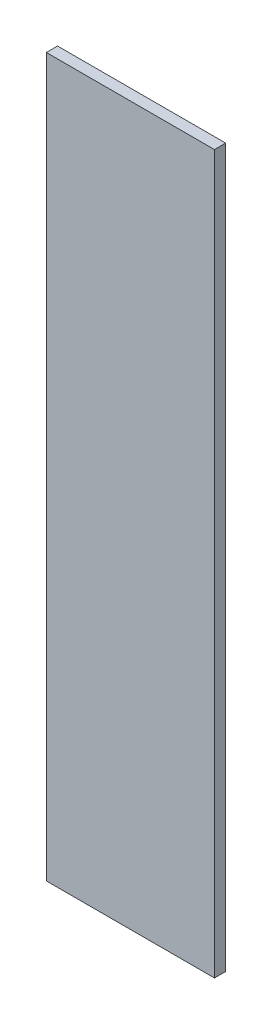
ISO-10303-21;
HEADER;
FILE_DESCRIPTION(('STEP AP214'),'2;1');
FILE_NAME('part.step','',(''),(''),'','','');
FILE_SCHEMA(('AUTOMOTIVE_DESIGN { 1 0 10303 214 1 1 1 1 }'));
ENDSEC;
DATA;
#1=APPLICATION_CONTEXT('core data for automotive mechanical design processes');
#2=APPLICATION_PROTOCOL_DEFINITION('international standard','automotive_design',2000,#1);
#3=PRODUCT_CONTEXT('',#1,'mechanical');
#4=PRODUCT('Part','Part','',(#3));
#5=PRODUCT_RELATED_PRODUCT_CATEGORY('part','',(#4));
#6=PRODUCT_DEFINITION_FORMATION('','',#4);
#7=PRODUCT_DEFINITION_CONTEXT('part definition',#1,'design');
#8=PRODUCT_DEFINITION('design','',#6,#7);
#9=PRODUCT_DEFINITION_SHAPE('','',#8);
#10=(LENGTH_UNIT() NAMED_UNIT(*) SI_UNIT(.MILLI.,.METRE.));
#11=(NAMED_UNIT(*) PLANE_ANGLE_UNIT() SI_UNIT($,.RADIAN.));
#12=(NAMED_UNIT(*) SI_UNIT($,.STERADIAN.) SOLID_ANGLE_UNIT());
#13=UNCERTAINTY_MEASURE_WITH_UNIT(LENGTH_MEASURE(1.E-05),#10,'distance_accuracy_value','');
#14=(GEOMETRIC_REPRESENTATION_CONTEXT(3) GLOBAL_UNCERTAINTY_ASSIGNED_CONTEXT((#13)) GLOBAL_UNIT_ASSIGNED_CONTEXT((#10,
#11,#12)) REPRESENTATION_CONTEXT('',''));
#15=CARTESIAN_POINT('',(0.,0.,0.));
#16=DIRECTION('',(0.,0.,1.));
#17=DIRECTION('',(1.,0.,0.));
#18=AXIS2_PLACEMENT_3D('',#15,#16,#17);
#19=CARTESIAN_POINT('',(-14.5,-32.,-1.));
#20=DIRECTION('',(1.,0.,0.));
#21=DIRECTION('',(0.,0.,-1.));
#22=AXIS2_PLACEMENT_3D('',#19,#20,#21);
#23=PLANE('',#22);
#24=DIRECTION('',(0.,1.,0.));
#25=VECTOR('',#24,1.);
#26=CARTESIAN_POINT('',(-14.5,-32.,0.));
#27=LINE('',#26,#25);
#28=CARTESIAN_POINT('',(-14.5,-32.,0.));
#29=VERTEX_POINT('',#28);
#30=CARTESIAN_POINT('',(-14.5,32.,0.));
#31=VERTEX_POINT('',#30);
#32=EDGE_CURVE('E101',#29,#31,#27,.T.);
#33=ORIENTED_EDGE('',*,*,#32,.F.);
#34=DIRECTION('',(0.,0.,1.));
#35=VECTOR('',#34,1.);
#36=CARTESIAN_POINT('',(-14.5,-32.,-1.));
#37=LINE('',#36,#35);
#38=CARTESIAN_POINT('',(-14.5,-32.,-1.));
#39=VERTEX_POINT('',#38);
#40=EDGE_CURVE('E11',#39,#29,#37,.T.);
#41=ORIENTED_EDGE('',*,*,#40,.F.);
#42=DIRECTION('',(0.,1.,0.));
#43=VECTOR('',#42,1.);
#44=CARTESIAN_POINT('',(-14.5,-32.,-1.));
#45=LINE('',#44,#43);
#46=CARTESIAN_POINT('',(-14.5,32.,-1.));
#47=VERTEX_POINT('',#46);
#48=EDGE_CURVE('E95',#39,#47,#45,.T.);
#49=ORIENTED_EDGE('',*,*,#48,.T.);
#50=DIRECTION('',(0.,0.,1.));
#51=VECTOR('',#50,1.);
#52=CARTESIAN_POINT('',(-14.5,32.,-1.));
#53=LINE('',#52,#51);
#54=EDGE_CURVE('E40',#47,#31,#53,.T.);
#55=ORIENTED_EDGE('',*,*,#54,.T.);
#56=EDGE_LOOP('',(#33,#41,#49,#55));
#57=FACE_BOUND('',#56,.T.);
#58=ADVANCED_FACE('F37',(#57),#23,.T.);
#59=CARTESIAN_POINT('',(-14.5,-32.,-1.));
#60=DIRECTION('',(0.,-1.,0.));
#61=DIRECTION('',(0.,0.,-1.));
#62=AXIS2_PLACEMENT_3D('',#59,#60,#61);
#63=PLANE('',#62);
#64=DIRECTION('',(1.,0.,0.));
#65=VECTOR('',#64,1.);
#66=CARTESIAN_POINT('',(-14.5,-32.,0.));
#67=LINE('',#66,#65);
#68=CARTESIAN_POINT('',(-29.5,-32.,0.));
#69=VERTEX_POINT('',#68);
#70=EDGE_CURVE('E97',#69,#29,#67,.T.);
#71=ORIENTED_EDGE('',*,*,#70,.F.);
#72=DIRECTION('',(0.,0.,1.));
#73=VECTOR('',#72,1.);
#74=CARTESIAN_POINT('',(-29.5,-32.,-1.));
#75=LINE('',#74,#73);
#76=CARTESIAN_POINT('',(-29.5,-32.,-1.));
#77=VERTEX_POINT('',#76);
#78=EDGE_CURVE('E46',#77,#69,#75,.T.);
#79=ORIENTED_EDGE('',*,*,#78,.F.);
#80=DIRECTION('',(1.,0.,0.));
#81=VECTOR('',#80,1.);
#82=CARTESIAN_POINT('',(-14.5,-32.,-1.));
#83=LINE('',#82,#81);
#84=EDGE_CURVE('E92',#77,#39,#83,.T.);
#85=ORIENTED_EDGE('',*,*,#84,.T.);
#86=ORIENTED_EDGE('',*,*,#40,.T.);
#87=EDGE_LOOP('',(#71,#79,#85,#86));
#88=FACE_BOUND('',#87,.T.);
#89=ADVANCED_FACE('F111',(#88),#63,.T.);
#90=CARTESIAN_POINT('',(-29.5,-32.,-1.));
#91=DIRECTION('',(-1.,0.,0.));
#92=DIRECTION('',(0.,-1.,0.));
#93=AXIS2_PLACEMENT_3D('',#90,#91,#92);
#94=PLANE('',#93);
#95=DIRECTION('',(0.,-1.,0.));
#96=VECTOR('',#95,1.);
#97=CARTESIAN_POINT('',(-29.5,-32.,0.));
#98=LINE('',#97,#96);
#99=CARTESIAN_POINT('',(-29.5,32.,0.));
#100=VERTEX_POINT('',#99);
#101=EDGE_CURVE('E87',#100,#69,#98,.T.);
#102=ORIENTED_EDGE('',*,*,#101,.F.);
#103=DIRECTION('',(0.,0.,1.));
#104=VECTOR('',#103,1.);
#105=CARTESIAN_POINT('',(-29.5,32.,-1.));
#106=LINE('',#105,#104);
#107=CARTESIAN_POINT('',(-29.5,32.,-1.));
#108=VERTEX_POINT('',#107);
#109=EDGE_CURVE('E82',#108,#100,#106,.T.);
#110=ORIENTED_EDGE('',*,*,#109,.F.);
#111=DIRECTION('',(0.,-1.,0.));
#112=VECTOR('',#111,1.);
#113=CARTESIAN_POINT('',(-29.5,-32.,-1.));
#114=LINE('',#113,#112);
#115=EDGE_CURVE('E85',#108,#77,#114,.T.);
#116=ORIENTED_EDGE('',*,*,#115,.T.);
#117=ORIENTED_EDGE('',*,*,#78,.T.);
#118=EDGE_LOOP('',(#102,#110,#116,#117));
#119=FACE_BOUND('',#118,.T.);
#120=ADVANCED_FACE('F84',(#119),#94,.T.);
#121=CARTESIAN_POINT('',(-14.5,32.,-1.));
#122=DIRECTION('',(0.,1.,0.));
#123=DIRECTION('',(0.,0.,1.));
#124=AXIS2_PLACEMENT_3D('',#121,#122,#123);
#125=PLANE('',#124);
#126=DIRECTION('',(-1.,0.,0.));
#127=VECTOR('',#126,1.);
#128=CARTESIAN_POINT('',(-14.5,32.,0.));
#129=LINE('',#128,#127);
#130=EDGE_CURVE('E104',#31,#100,#129,.T.);
#131=ORIENTED_EDGE('',*,*,#130,.F.);
#132=ORIENTED_EDGE('',*,*,#54,.F.);
#133=DIRECTION('',(-1.,0.,0.));
#134=VECTOR('',#133,1.);
#135=CARTESIAN_POINT('',(-14.5,32.,-1.));
#136=LINE('',#135,#134);
#137=EDGE_CURVE('E91',#47,#108,#136,.T.);
#138=ORIENTED_EDGE('',*,*,#137,.T.);
#139=ORIENTED_EDGE('',*,*,#109,.T.);
#140=EDGE_LOOP('',(#131,#132,#138,#139));
#141=FACE_BOUND('',#140,.T.);
#142=ADVANCED_FACE('F94',(#141),#125,.T.);
#143=CARTESIAN_POINT('',(0.,0.,-1.));
#144=DIRECTION('',(0.,0.,1.));
#145=DIRECTION('',(1.,0.,0.));
#146=AXIS2_PLACEMENT_3D('',#143,#144,#145);
#147=PLANE('',#146);
#148=ORIENTED_EDGE('',*,*,#48,.F.);
#149=ORIENTED_EDGE('',*,*,#84,.F.);
#150=ORIENTED_EDGE('',*,*,#115,.F.);
#151=ORIENTED_EDGE('',*,*,#137,.F.);
#152=EDGE_LOOP('',(#148,#149,#150,#151));
#153=FACE_BOUND('',#152,.T.);
#154=ADVANCED_FACE('F90',(#153),#147,.F.);
#155=CARTESIAN_POINT('',(0.,0.,0.));
#156=DIRECTION('',(0.,0.,1.));
#157=DIRECTION('',(1.,0.,0.));
#158=AXIS2_PLACEMENT_3D('',#155,#156,#157);
#159=PLANE('',#158);
#160=ORIENTED_EDGE('',*,*,#32,.T.);
#161=ORIENTED_EDGE('',*,*,#130,.T.);
#162=ORIENTED_EDGE('',*,*,#101,.T.);
#163=ORIENTED_EDGE('',*,*,#70,.T.);
#164=EDGE_LOOP('',(#160,#161,#162,#163));
#165=FACE_BOUND('',#164,.T.);
#166=ADVANCED_FACE('F110',(#165),#159,.T.);
#167=CLOSED_SHELL('',(#58,#89,#120,#142,#154,#166));
#168=MANIFOLD_SOLID_BREP('B2',#167);
#169=ADVANCED_BREP_SHAPE_REPRESENTATION('',(#18,#168),#14);
#170=SHAPE_DEFINITION_REPRESENTATION(#9,#169);
ENDSEC;
END-ISO-10303-21;
